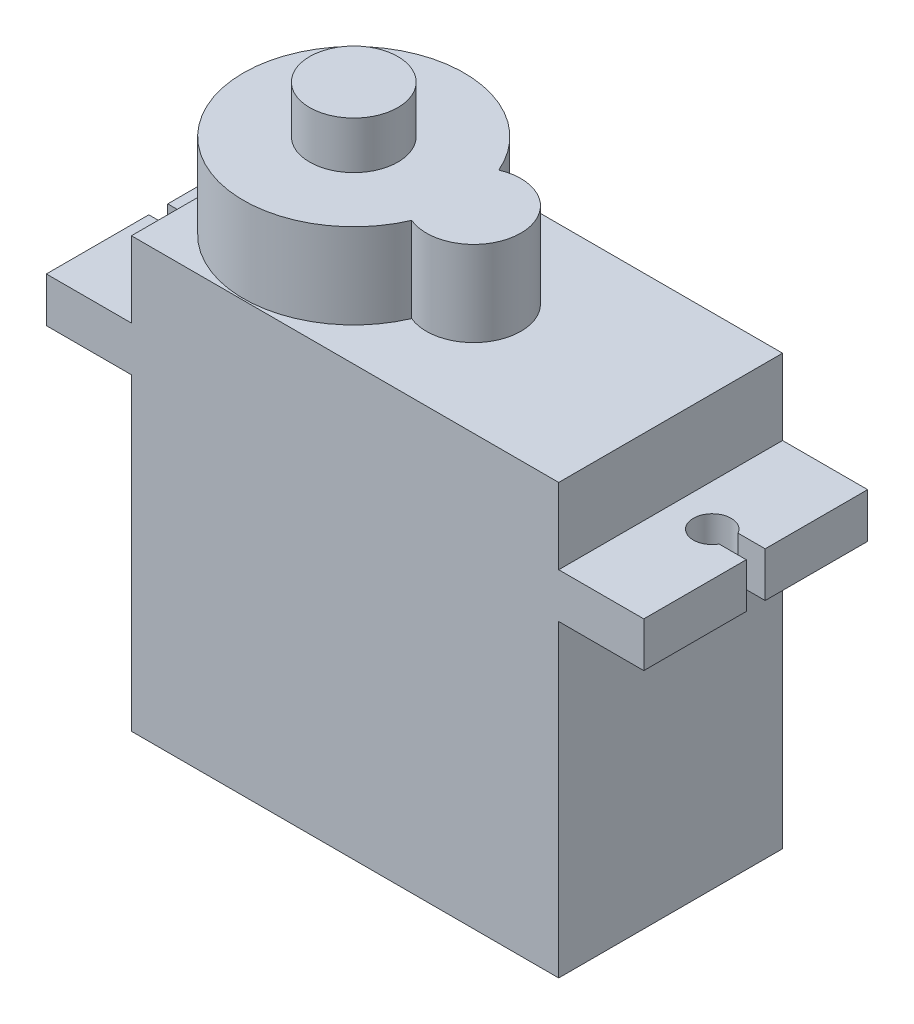
ISO-10303-21;
HEADER;
FILE_DESCRIPTION(('STEP AP214'),'2;1');
FILE_NAME('part.step','',(''),(''),'','','');
FILE_SCHEMA(('AUTOMOTIVE_DESIGN { 1 0 10303 214 1 1 1 1 }'));
ENDSEC;
DATA;
#1=APPLICATION_CONTEXT('core data for automotive mechanical design processes');
#2=APPLICATION_PROTOCOL_DEFINITION('international standard','automotive_design',2000,#1);
#3=PRODUCT_CONTEXT('',#1,'mechanical');
#4=PRODUCT('Part','Part','',(#3));
#5=PRODUCT_RELATED_PRODUCT_CATEGORY('part','',(#4));
#6=PRODUCT_DEFINITION_FORMATION('','',#4);
#7=PRODUCT_DEFINITION_CONTEXT('part definition',#1,'design');
#8=PRODUCT_DEFINITION('design','',#6,#7);
#9=PRODUCT_DEFINITION_SHAPE('','',#8);
#10=(LENGTH_UNIT() NAMED_UNIT(*) SI_UNIT(.MILLI.,.METRE.));
#11=(NAMED_UNIT(*) PLANE_ANGLE_UNIT() SI_UNIT($,.RADIAN.));
#12=(NAMED_UNIT(*) SI_UNIT($,.STERADIAN.) SOLID_ANGLE_UNIT());
#13=UNCERTAINTY_MEASURE_WITH_UNIT(LENGTH_MEASURE(1.E-05),#10,'distance_accuracy_value','');
#14=(GEOMETRIC_REPRESENTATION_CONTEXT(3) GLOBAL_UNCERTAINTY_ASSIGNED_CONTEXT((#13)) GLOBAL_UNIT_ASSIGNED_CONTEXT((#10,
#11,#12)) REPRESENTATION_CONTEXT('',''));
#15=CARTESIAN_POINT('',(0.,0.,0.));
#16=DIRECTION('',(0.,0.,1.));
#17=DIRECTION('',(1.,0.,0.));
#18=AXIS2_PLACEMENT_3D('',#15,#16,#17);
#19=CARTESIAN_POINT('',(-50.695532413833,0.,0.));
#20=DIRECTION('',(-1.,0.,0.));
#21=DIRECTION('',(0.,0.,1.));
#22=AXIS2_PLACEMENT_3D('',#19,#20,#21);
#23=PLANE('',#22);
#24=DIRECTION('',(0.,0.,-1.));
#25=VECTOR('',#24,1.);
#26=CARTESIAN_POINT('',(-50.695532413833,16.33,0.));
#27=LINE('',#26,#25);
#28=CARTESIAN_POINT('',(-50.695532413833,16.33,0.836861805785775));
#29=VERTEX_POINT('',#28);
#30=CARTESIAN_POINT('',(-50.695532413833,16.33,-4.58313819421423));
#31=VERTEX_POINT('',#30);
#32=EDGE_CURVE('E255',#29,#31,#27,.T.);
#33=ORIENTED_EDGE('',*,*,#32,.F.);
#34=DIRECTION('',(0.,1.,0.));
#35=VECTOR('',#34,1.);
#36=CARTESIAN_POINT('',(-50.695532413833,0.,0.836861805785775));
#37=LINE('',#36,#35);
#38=CARTESIAN_POINT('',(-50.695532413833,18.7,0.836861805785775));
#39=VERTEX_POINT('',#38);
#40=EDGE_CURVE('E46',#29,#39,#37,.T.);
#41=ORIENTED_EDGE('',*,*,#40,.T.);
#42=DIRECTION('',(0.,0.,-1.));
#43=VECTOR('',#42,1.);
#44=CARTESIAN_POINT('',(-50.695532413833,18.7,0.));
#45=LINE('',#44,#43);
#46=CARTESIAN_POINT('',(-50.695532413833,18.7,-4.58313819421423));
#47=VERTEX_POINT('',#46);
#48=EDGE_CURVE('E257',#39,#47,#45,.T.);
#49=ORIENTED_EDGE('',*,*,#48,.T.);
#50=DIRECTION('',(0.,-1.,0.));
#51=VECTOR('',#50,1.);
#52=CARTESIAN_POINT('',(-50.695532413833,0.,-4.58313819421423));
#53=LINE('',#52,#51);
#54=EDGE_CURVE('E261',#47,#31,#53,.T.);
#55=ORIENTED_EDGE('',*,*,#54,.T.);
#56=EDGE_LOOP('',(#33,#41,#49,#55));
#57=FACE_BOUND('',#56,.T.);
#58=ADVANCED_FACE('F38',(#57),#23,.T.);
#59=CARTESIAN_POINT('',(-46.195532413833,22.7,-4.58313819421423));
#60=DIRECTION('',(1.,0.,0.));
#61=DIRECTION('',(0.,0.,-1.));
#62=AXIS2_PLACEMENT_3D('',#59,#60,#61);
#63=PLANE('',#62);
#64=DIRECTION('',(0.,0.,-1.));
#65=VECTOR('',#64,1.);
#66=CARTESIAN_POINT('',(-46.195532413833,18.7,0.));
#67=LINE('',#66,#65);
#68=CARTESIAN_POINT('',(-46.195532413833,18.7,7.25686180578577));
#69=VERTEX_POINT('',#68);
#70=CARTESIAN_POINT('',(-46.195532413833,18.7,-4.58313819421423));
#71=VERTEX_POINT('',#70);
#72=EDGE_CURVE('E266',#69,#71,#67,.T.);
#73=ORIENTED_EDGE('',*,*,#72,.F.);
#74=DIRECTION('',(0.,-1.,0.));
#75=VECTOR('',#74,1.);
#76=CARTESIAN_POINT('',(-46.195532413833,22.7,7.25686180578577));
#77=LINE('',#76,#75);
#78=CARTESIAN_POINT('',(-46.195532413833,22.7,7.25686180578577));
#79=VERTEX_POINT('',#78);
#80=EDGE_CURVE('E352',#79,#69,#77,.T.);
#81=ORIENTED_EDGE('',*,*,#80,.F.);
#82=DIRECTION('',(0.,0.,1.));
#83=VECTOR('',#82,1.);
#84=CARTESIAN_POINT('',(-46.195532413833,22.7,-4.58313819421423));
#85=LINE('',#84,#83);
#86=CARTESIAN_POINT('',(-46.195532413833,22.7,1.33686180578577));
#87=VERTEX_POINT('',#86);
#88=EDGE_CURVE('E459',#87,#79,#85,.T.);
#89=ORIENTED_EDGE('',*,*,#88,.F.);
#90=CARTESIAN_POINT('',(-46.195532413833,22.7,-4.58313819421423));
#91=VERTEX_POINT('',#90);
#92=EDGE_CURVE('E499',#91,#87,#85,.T.);
#93=ORIENTED_EDGE('',*,*,#92,.F.);
#94=DIRECTION('',(0.,-1.,0.));
#95=VECTOR('',#94,1.);
#96=CARTESIAN_POINT('',(-46.195532413833,22.7,-4.58313819421423));
#97=LINE('',#96,#95);
#98=EDGE_CURVE('E460',#91,#71,#97,.T.);
#99=ORIENTED_EDGE('',*,*,#98,.T.);
#100=EDGE_LOOP('',(#73,#81,#89,#93,#99));
#101=FACE_BOUND('',#100,.T.);
#102=ADVANCED_FACE('F382',(#101),#63,.F.);
#103=CARTESIAN_POINT('',(-19.095532413833,16.33,0.));
#104=DIRECTION('',(0.,1.,0.));
#105=DIRECTION('',(0.,0.,1.));
#106=AXIS2_PLACEMENT_3D('',#103,#104,#105);
#107=PLANE('',#106);
#108=DIRECTION('',(-1.,0.,0.));
#109=VECTOR('',#108,1.);
#110=CARTESIAN_POINT('',(-19.095532413833,16.33,1.83686180578577));
#111=LINE('',#110,#109);
#112=CARTESIAN_POINT('',(-19.095532413833,16.33,1.83686180578577));
#113=VERTEX_POINT('',#112);
#114=CARTESIAN_POINT('',(-20.5295070100486,16.33,1.83686180578577));
#115=VERTEX_POINT('',#114);
#116=EDGE_CURVE('E295',#113,#115,#111,.T.);
#117=ORIENTED_EDGE('',*,*,#116,.F.);
#118=DIRECTION('',(0.,0.,-1.));
#119=VECTOR('',#118,1.);
#120=CARTESIAN_POINT('',(-19.095532413833,16.33,0.));
#121=LINE('',#120,#119);
#122=CARTESIAN_POINT('',(-19.095532413833,16.33,7.25686180578577));
#123=VERTEX_POINT('',#122);
#124=EDGE_CURVE('E306',#123,#113,#121,.T.);
#125=ORIENTED_EDGE('',*,*,#124,.F.);
#126=DIRECTION('',(-1.,0.,0.));
#127=VECTOR('',#126,1.);
#128=CARTESIAN_POINT('',(-19.095532413833,16.33,7.25686180578577));
#129=LINE('',#128,#127);
#130=CARTESIAN_POINT('',(-23.595532413833,16.33,7.25686180578577));
#131=VERTEX_POINT('',#130);
#132=EDGE_CURVE('E331',#123,#131,#129,.T.);
#133=ORIENTED_EDGE('',*,*,#132,.T.);
#134=DIRECTION('',(0.,0.,-1.));
#135=VECTOR('',#134,1.);
#136=CARTESIAN_POINT('',(-23.595532413833,16.33,0.));
#137=LINE('',#136,#135);
#138=CARTESIAN_POINT('',(-23.595532413833,16.33,-4.58313819421423));
#139=VERTEX_POINT('',#138);
#140=EDGE_CURVE('E300',#131,#139,#137,.T.);
#141=ORIENTED_EDGE('',*,*,#140,.T.);
#142=DIRECTION('',(-1.,0.,0.));
#143=VECTOR('',#142,1.);
#144=CARTESIAN_POINT('',(-19.095532413833,16.33,-4.58313819421423));
#145=LINE('',#144,#143);
#146=CARTESIAN_POINT('',(-19.095532413833,16.33,-4.58313819421423));
#147=VERTEX_POINT('',#146);
#148=EDGE_CURVE('E328',#147,#139,#145,.T.);
#149=ORIENTED_EDGE('',*,*,#148,.F.);
#150=CARTESIAN_POINT('',(-19.095532413833,16.33,0.836861805785775));
#151=VERTEX_POINT('',#150);
#152=EDGE_CURVE('E304',#151,#147,#121,.T.);
#153=ORIENTED_EDGE('',*,*,#152,.F.);
#154=DIRECTION('',(-1.,0.,0.));
#155=VECTOR('',#154,1.);
#156=CARTESIAN_POINT('',(-19.095532413833,16.33,0.836861805785775));
#157=LINE('',#156,#155);
#158=CARTESIAN_POINT('',(-20.5295070100486,16.33,0.836861805785775));
#159=VERTEX_POINT('',#158);
#160=EDGE_CURVE('E291',#151,#159,#157,.T.);
#161=ORIENTED_EDGE('',*,*,#160,.T.);
#162=CARTESIAN_POINT('',(-21.395532413833,16.33,1.33686180578577));
#163=DIRECTION('',(0.,1.,0.));
#164=DIRECTION('',(0.,0.,1.));
#165=AXIS2_PLACEMENT_3D('',#162,#163,#164);
#166=CIRCLE('',#165,1.);
#167=EDGE_CURVE('E297',#159,#115,#166,.T.);
#168=ORIENTED_EDGE('',*,*,#167,.T.);
#169=EDGE_LOOP('',(#117,#125,#133,#141,#149,#153,#161,#168));
#170=FACE_BOUND('',#169,.T.);
#171=ADVANCED_FACE('F388',(#170),#107,.F.);
#172=CARTESIAN_POINT('',(-19.095532413833,18.7,0.));
#173=DIRECTION('',(0.,1.,0.));
#174=DIRECTION('',(0.,0.,1.));
#175=AXIS2_PLACEMENT_3D('',#172,#173,#174);
#176=PLANE('',#175);
#177=DIRECTION('',(0.,0.,-1.));
#178=VECTOR('',#177,1.);
#179=CARTESIAN_POINT('',(-19.095532413833,18.7,0.));
#180=LINE('',#179,#178);
#181=CARTESIAN_POINT('',(-19.095532413833,18.7,7.25686180578577));
#182=VERTEX_POINT('',#181);
#183=CARTESIAN_POINT('',(-19.095532413833,18.7,1.83686180578577));
#184=VERTEX_POINT('',#183);
#185=EDGE_CURVE('E313',#182,#184,#180,.T.);
#186=ORIENTED_EDGE('',*,*,#185,.T.);
#187=DIRECTION('',(-1.,0.,0.));
#188=VECTOR('',#187,1.);
#189=CARTESIAN_POINT('',(0.,18.7,1.83686180578577));
#190=LINE('',#189,#188);
#191=CARTESIAN_POINT('',(-20.5295070100486,18.7,1.83686180578577));
#192=VERTEX_POINT('',#191);
#193=EDGE_CURVE('E285',#184,#192,#190,.T.);
#194=ORIENTED_EDGE('',*,*,#193,.T.);
#195=CARTESIAN_POINT('',(-21.395532413833,18.7,1.33686180578577));
#196=DIRECTION('',(0.,1.,0.));
#197=DIRECTION('',(0.,0.,1.));
#198=AXIS2_PLACEMENT_3D('',#195,#196,#197);
#199=CIRCLE('',#198,1.);
#200=CARTESIAN_POINT('',(-20.5295070100486,18.7,0.836861805785775));
#201=VERTEX_POINT('',#200);
#202=EDGE_CURVE('E282',#201,#192,#199,.T.);
#203=ORIENTED_EDGE('',*,*,#202,.F.);
#204=DIRECTION('',(-1.,0.,0.));
#205=VECTOR('',#204,1.);
#206=CARTESIAN_POINT('',(0.,18.7,0.836861805785775));
#207=LINE('',#206,#205);
#208=CARTESIAN_POINT('',(-19.095532413833,18.7,0.836861805785775));
#209=VERTEX_POINT('',#208);
#210=EDGE_CURVE('E279',#209,#201,#207,.T.);
#211=ORIENTED_EDGE('',*,*,#210,.F.);
#212=CARTESIAN_POINT('',(-19.095532413833,18.7,-4.58313819421423));
#213=VERTEX_POINT('',#212);
#214=EDGE_CURVE('E312',#209,#213,#180,.T.);
#215=ORIENTED_EDGE('',*,*,#214,.T.);
#216=DIRECTION('',(-1.,0.,0.));
#217=VECTOR('',#216,1.);
#218=CARTESIAN_POINT('',(-19.095532413833,18.7,-4.58313819421423));
#219=LINE('',#218,#217);
#220=CARTESIAN_POINT('',(-23.595532413833,18.7,-4.58313819421423));
#221=VERTEX_POINT('',#220);
#222=EDGE_CURVE('E332',#213,#221,#219,.T.);
#223=ORIENTED_EDGE('',*,*,#222,.T.);
#224=DIRECTION('',(0.,0.,-1.));
#225=VECTOR('',#224,1.);
#226=CARTESIAN_POINT('',(-23.595532413833,18.7,0.));
#227=LINE('',#226,#225);
#228=CARTESIAN_POINT('',(-23.595532413833,18.7,7.25686180578577));
#229=VERTEX_POINT('',#228);
#230=EDGE_CURVE('E305',#229,#221,#227,.T.);
#231=ORIENTED_EDGE('',*,*,#230,.F.);
#232=DIRECTION('',(-1.,0.,0.));
#233=VECTOR('',#232,1.);
#234=CARTESIAN_POINT('',(-19.095532413833,18.7,7.25686180578577));
#235=LINE('',#234,#233);
#236=EDGE_CURVE('E316',#182,#229,#235,.T.);
#237=ORIENTED_EDGE('',*,*,#236,.F.);
#238=EDGE_LOOP('',(#186,#194,#203,#211,#215,#223,#231,#237));
#239=FACE_BOUND('',#238,.T.);
#240=ADVANCED_FACE('F488',(#239),#176,.T.);
#241=CARTESIAN_POINT('',(-19.095532413833,0.,0.));
#242=DIRECTION('',(1.,0.,0.));
#243=DIRECTION('',(0.,0.,-1.));
#244=AXIS2_PLACEMENT_3D('',#241,#242,#243);
#245=PLANE('',#244);
#246=ORIENTED_EDGE('',*,*,#124,.T.);
#247=DIRECTION('',(0.,1.,0.));
#248=VECTOR('',#247,1.);
#249=CARTESIAN_POINT('',(-19.095532413833,0.,1.83686180578577));
#250=LINE('',#249,#248);
#251=EDGE_CURVE('E351',#113,#184,#250,.T.);
#252=ORIENTED_EDGE('',*,*,#251,.T.);
#253=ORIENTED_EDGE('',*,*,#185,.F.);
#254=DIRECTION('',(0.,-1.,0.));
#255=VECTOR('',#254,1.);
#256=CARTESIAN_POINT('',(-19.095532413833,0.,7.25686180578577));
#257=LINE('',#256,#255);
#258=EDGE_CURVE('E301',#182,#123,#257,.T.);
#259=ORIENTED_EDGE('',*,*,#258,.T.);
#260=EDGE_LOOP('',(#246,#252,#253,#259));
#261=FACE_BOUND('',#260,.T.);
#262=ADVANCED_FACE('F485',(#261),#245,.T.);
#263=CARTESIAN_POINT('',(-23.595532413833,22.7,-4.58313819421423));
#264=DIRECTION('',(-1.,0.,0.));
#265=DIRECTION('',(0.,0.,1.));
#266=AXIS2_PLACEMENT_3D('',#263,#264,#265);
#267=PLANE('',#266);
#268=ORIENTED_EDGE('',*,*,#140,.F.);
#269=DIRECTION('',(0.,-1.,0.));
#270=VECTOR('',#269,1.);
#271=CARTESIAN_POINT('',(-23.595532413833,22.7,7.25686180578577));
#272=LINE('',#271,#270);
#273=CARTESIAN_POINT('',(-23.595532413833,0.,7.25686180578577));
#274=VERTEX_POINT('',#273);
#275=EDGE_CURVE('E325',#131,#274,#272,.T.);
#276=ORIENTED_EDGE('',*,*,#275,.T.);
#277=DIRECTION('',(0.,0.,-1.));
#278=VECTOR('',#277,1.);
#279=CARTESIAN_POINT('',(-23.595532413833,0.,-4.58313819421423));
#280=LINE('',#279,#278);
#281=CARTESIAN_POINT('',(-23.595532413833,0.,-4.58313819421423));
#282=VERTEX_POINT('',#281);
#283=EDGE_CURVE('E447',#274,#282,#280,.T.);
#284=ORIENTED_EDGE('',*,*,#283,.T.);
#285=DIRECTION('',(0.,-1.,0.));
#286=VECTOR('',#285,1.);
#287=CARTESIAN_POINT('',(-23.595532413833,22.7,-4.58313819421423));
#288=LINE('',#287,#286);
#289=EDGE_CURVE('E462',#139,#282,#288,.T.);
#290=ORIENTED_EDGE('',*,*,#289,.F.);
#291=EDGE_LOOP('',(#268,#276,#284,#290));
#292=FACE_BOUND('',#291,.T.);
#293=ADVANCED_FACE('F477',(#292),#267,.F.);
#294=CARTESIAN_POINT('',(-46.195532413833,22.7,7.25686180578577));
#295=DIRECTION('',(0.,1.,0.));
#296=DIRECTION('',(0.,0.,1.));
#297=AXIS2_PLACEMENT_3D('',#294,#295,#296);
#298=PLANE('',#297);
#299=CARTESIAN_POINT('',(-40.355532413833,22.7,1.33686180578577));
#300=DIRECTION('',(0.,1.,0.));
#301=DIRECTION('',(0.,0.,1.));
#302=AXIS2_PLACEMENT_3D('',#299,#300,#301);
#303=CIRCLE('',#302,5.84);
#304=CARTESIAN_POINT('',(-34.9887185337068,22.7,-0.965942739998552));
#305=VERTEX_POINT('',#304);
#306=EDGE_CURVE('E504',#305,#87,#303,.T.);
#307=ORIENTED_EDGE('',*,*,#306,.F.);
#308=CARTESIAN_POINT('',(-34.015532413833,22.7,1.33686180578577));
#309=DIRECTION('',(0.,1.,0.));
#310=DIRECTION('',(0.,0.,1.));
#311=AXIS2_PLACEMENT_3D('',#308,#309,#310);
#312=CIRCLE('',#311,2.5);
#313=CARTESIAN_POINT('',(-34.9887185337068,22.7,3.6396663515701));
#314=VERTEX_POINT('',#313);
#315=EDGE_CURVE('E337',#314,#305,#312,.T.);
#316=ORIENTED_EDGE('',*,*,#315,.F.);
#317=EDGE_CURVE('E450',#87,#314,#303,.T.);
#318=ORIENTED_EDGE('',*,*,#317,.F.);
#319=ORIENTED_EDGE('',*,*,#88,.T.);
#320=DIRECTION('',(1.,0.,0.));
#321=VECTOR('',#320,1.);
#322=CARTESIAN_POINT('',(-46.195532413833,22.7,7.25686180578577));
#323=LINE('',#322,#321);
#324=CARTESIAN_POINT('',(-23.595532413833,22.7,7.25686180578577));
#325=VERTEX_POINT('',#324);
#326=EDGE_CURVE('E498',#79,#325,#323,.T.);
#327=ORIENTED_EDGE('',*,*,#326,.T.);
#328=DIRECTION('',(0.,0.,-1.));
#329=VECTOR('',#328,1.);
#330=CARTESIAN_POINT('',(-23.595532413833,22.7,-4.58313819421423));
#331=LINE('',#330,#329);
#332=CARTESIAN_POINT('',(-23.595532413833,22.7,-4.58313819421423));
#333=VERTEX_POINT('',#332);
#334=EDGE_CURVE('E497',#325,#333,#331,.T.);
#335=ORIENTED_EDGE('',*,*,#334,.T.);
#336=DIRECTION('',(-1.,0.,0.));
#337=VECTOR('',#336,1.);
#338=CARTESIAN_POINT('',(-46.195532413833,22.7,-4.58313819421423));
#339=LINE('',#338,#337);
#340=EDGE_CURVE('E453',#333,#91,#339,.T.);
#341=ORIENTED_EDGE('',*,*,#340,.T.);
#342=ORIENTED_EDGE('',*,*,#92,.T.);
#343=EDGE_LOOP('',(#307,#316,#318,#319,#327,#335,#341,#342));
#344=FACE_BOUND('',#343,.T.);
#345=ADVANCED_FACE('F531',(#344),#298,.T.);
#346=CARTESIAN_POINT('',(-40.355532413833,27.2,1.33686180578577));
#347=DIRECTION('',(0.,-1.,0.));
#348=DIRECTION('',(0.,0.,-1.));
#349=AXIS2_PLACEMENT_3D('',#346,#347,#348);
#350=CYLINDRICAL_SURFACE('',#349,5.84);
#351=DIRECTION('',(0.,-1.,0.));
#352=VECTOR('',#351,1.);
#353=CARTESIAN_POINT('',(-34.9887185337068,27.2,3.6396663515701));
#354=LINE('',#353,#352);
#355=CARTESIAN_POINT('',(-34.9887185337068,27.2,3.6396663515701));
#356=VERTEX_POINT('',#355);
#357=EDGE_CURVE('E510',#356,#314,#354,.T.);
#358=ORIENTED_EDGE('',*,*,#357,.F.);
#359=CARTESIAN_POINT('',(-40.355532413833,27.2,1.33686180578577));
#360=DIRECTION('',(0.,1.,0.));
#361=DIRECTION('',(0.,0.,1.));
#362=AXIS2_PLACEMENT_3D('',#359,#360,#361);
#363=CIRCLE('',#362,5.84);
#364=CARTESIAN_POINT('',(-34.9887185337068,27.2,-0.965942739998555));
#365=VERTEX_POINT('',#364);
#366=EDGE_CURVE('E445',#365,#356,#363,.T.);
#367=ORIENTED_EDGE('',*,*,#366,.F.);
#368=DIRECTION('',(0.,-1.,0.));
#369=VECTOR('',#368,1.);
#370=CARTESIAN_POINT('',(-34.9887185337068,27.2,-0.965942739998552));
#371=LINE('',#370,#369);
#372=EDGE_CURVE('E514',#365,#305,#371,.T.);
#373=ORIENTED_EDGE('',*,*,#372,.T.);
#374=ORIENTED_EDGE('',*,*,#306,.T.);
#375=ORIENTED_EDGE('',*,*,#317,.T.);
#376=EDGE_LOOP('',(#358,#367,#373,#374,#375));
#377=FACE_BOUND('',#376,.T.);
#378=ADVANCED_FACE('F526',(#377),#350,.T.);
#379=CARTESIAN_POINT('',(0.,27.2,0.));
#380=DIRECTION('',(0.,1.,0.));
#381=DIRECTION('',(0.,0.,1.));
#382=AXIS2_PLACEMENT_3D('',#379,#380,#381);
#383=PLANE('',#382);
#384=ORIENTED_EDGE('',*,*,#366,.T.);
#385=CARTESIAN_POINT('',(-34.015532413833,27.2,1.33686180578577));
#386=DIRECTION('',(0.,1.,0.));
#387=DIRECTION('',(0.,0.,1.));
#388=AXIS2_PLACEMENT_3D('',#385,#386,#387);
#389=CIRCLE('',#388,2.5);
#390=EDGE_CURVE('E517',#356,#365,#389,.T.);
#391=ORIENTED_EDGE('',*,*,#390,.T.);
#392=EDGE_LOOP('',(#384,#391));
#393=FACE_BOUND('',#392,.T.);
#394=CARTESIAN_POINT('',(-40.355532413833,27.2,1.33686180578577));
#395=DIRECTION('',(0.,1.,0.));
#396=DIRECTION('',(0.,0.,1.));
#397=AXIS2_PLACEMENT_3D('',#394,#395,#396);
#398=CIRCLE('',#397,2.335);
#399=CARTESIAN_POINT('',(-40.355532413833,27.2,3.67186180578577));
#400=VERTEX_POINT('',#399);
#401=EDGE_CURVE('E506',#400,#400,#398,.T.);
#402=ORIENTED_EDGE('',*,*,#401,.F.);
#403=EDGE_LOOP('',(#402));
#404=FACE_BOUND('',#403,.T.);
#405=ADVANCED_FACE('F521',(#393,#404),#383,.T.);
#406=CARTESIAN_POINT('',(-46.195532413833,16.33,7.25686180578577));
#407=VERTEX_POINT('',#406);
#408=CARTESIAN_POINT('',(-46.195532413833,0.,7.25686180578577));
#409=VERTEX_POINT('',#408);
#410=EDGE_CURVE('E61',#407,#409,#77,.T.);
#411=ORIENTED_EDGE('',*,*,#410,.F.);
#412=DIRECTION('',(0.,0.,-1.));
#413=VECTOR('',#412,1.);
#414=CARTESIAN_POINT('',(-46.195532413833,16.33,0.));
#415=LINE('',#414,#413);
#416=CARTESIAN_POINT('',(-46.195532413833,16.33,-4.58313819421423));
#417=VERTEX_POINT('',#416);
#418=EDGE_CURVE('E250',#407,#417,#415,.T.);
#419=ORIENTED_EDGE('',*,*,#418,.T.);
#420=CARTESIAN_POINT('',(-46.195532413833,0.,-4.58313819421423));
#421=VERTEX_POINT('',#420);
#422=EDGE_CURVE('E363',#417,#421,#97,.T.);
#423=ORIENTED_EDGE('',*,*,#422,.T.);
#424=DIRECTION('',(0.,0.,1.));
#425=VECTOR('',#424,1.);
#426=CARTESIAN_POINT('',(-46.195532413833,0.,-4.58313819421423));
#427=LINE('',#426,#425);
#428=EDGE_CURVE('E441',#421,#409,#427,.T.);
#429=ORIENTED_EDGE('',*,*,#428,.T.);
#430=EDGE_LOOP('',(#411,#419,#423,#429));
#431=FACE_BOUND('',#430,.T.);
#432=ADVANCED_FACE('F40',(#431),#63,.F.);
#433=CARTESIAN_POINT('',(-46.195532413833,22.7,7.25686180578577));
#434=DIRECTION('',(0.,0.,-1.));
#435=DIRECTION('',(-1.,0.,0.));
#436=AXIS2_PLACEMENT_3D('',#433,#434,#435);
#437=PLANE('',#436);
#438=DIRECTION('',(1.,0.,0.));
#439=VECTOR('',#438,1.);
#440=CARTESIAN_POINT('',(-46.195532413833,0.,7.25686180578577));
#441=LINE('',#440,#439);
#442=EDGE_CURVE('E444',#409,#274,#441,.T.);
#443=ORIENTED_EDGE('',*,*,#442,.T.);
#444=ORIENTED_EDGE('',*,*,#275,.F.);
#445=ORIENTED_EDGE('',*,*,#132,.F.);
#446=ORIENTED_EDGE('',*,*,#258,.F.);
#447=ORIENTED_EDGE('',*,*,#236,.T.);
#448=EDGE_CURVE('E471',#325,#229,#272,.T.);
#449=ORIENTED_EDGE('',*,*,#448,.F.);
#450=ORIENTED_EDGE('',*,*,#326,.F.);
#451=ORIENTED_EDGE('',*,*,#80,.T.);
#452=DIRECTION('',(1.,0.,0.));
#453=VECTOR('',#452,1.);
#454=CARTESIAN_POINT('',(-50.695532413833,18.7,7.25686180578577));
#455=LINE('',#454,#453);
#456=CARTESIAN_POINT('',(-50.695532413833,18.7,7.25686180578577));
#457=VERTEX_POINT('',#456);
#458=EDGE_CURVE('E274',#457,#69,#455,.T.);
#459=ORIENTED_EDGE('',*,*,#458,.F.);
#460=DIRECTION('',(0.,1.,0.));
#461=VECTOR('',#460,1.);
#462=CARTESIAN_POINT('',(-50.695532413833,0.,7.25686180578577));
#463=LINE('',#462,#461);
#464=CARTESIAN_POINT('',(-50.695532413833,16.33,7.25686180578577));
#465=VERTEX_POINT('',#464);
#466=EDGE_CURVE('E254',#465,#457,#463,.T.);
#467=ORIENTED_EDGE('',*,*,#466,.F.);
#468=DIRECTION('',(1.,0.,0.));
#469=VECTOR('',#468,1.);
#470=CARTESIAN_POINT('',(-50.695532413833,16.33,7.25686180578577));
#471=LINE('',#470,#469);
#472=EDGE_CURVE('E277',#465,#407,#471,.T.);
#473=ORIENTED_EDGE('',*,*,#472,.T.);
#474=ORIENTED_EDGE('',*,*,#410,.T.);
#475=EDGE_LOOP('',(#443,#444,#445,#446,#447,#449,#450,#451,#459,#467,#473,#474));
#476=FACE_BOUND('',#475,.T.);
#477=ADVANCED_FACE('F406',(#476),#437,.F.);
#478=ORIENTED_EDGE('',*,*,#448,.T.);
#479=ORIENTED_EDGE('',*,*,#230,.T.);
#480=EDGE_CURVE('E469',#333,#221,#288,.T.);
#481=ORIENTED_EDGE('',*,*,#480,.F.);
#482=ORIENTED_EDGE('',*,*,#334,.F.);
#483=EDGE_LOOP('',(#478,#479,#481,#482));
#484=FACE_BOUND('',#483,.T.);
#485=ADVANCED_FACE('F491',(#484),#267,.F.);
#486=CARTESIAN_POINT('',(-46.195532413833,22.7,-4.58313819421423));
#487=DIRECTION('',(0.,0.,1.));
#488=DIRECTION('',(1.,0.,0.));
#489=AXIS2_PLACEMENT_3D('',#486,#487,#488);
#490=PLANE('',#489);
#491=DIRECTION('',(-1.,0.,0.));
#492=VECTOR('',#491,1.);
#493=CARTESIAN_POINT('',(-46.195532413833,0.,-4.58313819421423));
#494=LINE('',#493,#492);
#495=EDGE_CURVE('E443',#282,#421,#494,.T.);
#496=ORIENTED_EDGE('',*,*,#495,.T.);
#497=ORIENTED_EDGE('',*,*,#422,.F.);
#498=DIRECTION('',(1.,0.,0.));
#499=VECTOR('',#498,1.);
#500=CARTESIAN_POINT('',(-50.695532413833,16.33,-4.58313819421423));
#501=LINE('',#500,#499);
#502=EDGE_CURVE('E264',#31,#417,#501,.T.);
#503=ORIENTED_EDGE('',*,*,#502,.F.);
#504=ORIENTED_EDGE('',*,*,#54,.F.);
#505=DIRECTION('',(1.,0.,0.));
#506=VECTOR('',#505,1.);
#507=CARTESIAN_POINT('',(-50.695532413833,18.7,-4.58313819421423));
#508=LINE('',#507,#506);
#509=EDGE_CURVE('E271',#47,#71,#508,.T.);
#510=ORIENTED_EDGE('',*,*,#509,.T.);
#511=ORIENTED_EDGE('',*,*,#98,.F.);
#512=ORIENTED_EDGE('',*,*,#340,.F.);
#513=ORIENTED_EDGE('',*,*,#480,.T.);
#514=ORIENTED_EDGE('',*,*,#222,.F.);
#515=DIRECTION('',(0.,1.,0.));
#516=VECTOR('',#515,1.);
#517=CARTESIAN_POINT('',(-19.095532413833,0.,-4.58313819421423));
#518=LINE('',#517,#516);
#519=EDGE_CURVE('E309',#147,#213,#518,.T.);
#520=ORIENTED_EDGE('',*,*,#519,.F.);
#521=ORIENTED_EDGE('',*,*,#148,.T.);
#522=ORIENTED_EDGE('',*,*,#289,.T.);
#523=EDGE_LOOP('',(#496,#497,#503,#504,#510,#511,#512,#513,#514,#520,#521,#522));
#524=FACE_BOUND('',#523,.T.);
#525=ADVANCED_FACE('F362',(#524),#490,.F.);
#526=CARTESIAN_POINT('',(-46.195532413833,0.,7.25686180578577));
#527=DIRECTION('',(0.,1.,0.));
#528=DIRECTION('',(0.,0.,1.));
#529=AXIS2_PLACEMENT_3D('',#526,#527,#528);
#530=PLANE('',#529);
#531=CARTESIAN_POINT('',(-40.355532413833,0.,1.33686180578577));
#532=DIRECTION('',(0.,-1.,0.));
#533=DIRECTION('',(0.,0.,-1.));
#534=AXIS2_PLACEMENT_3D('',#531,#532,#533);
#535=CIRCLE('',#534,2.5);
#536=CARTESIAN_POINT('',(-40.355532413833,0.,-1.16313819421423));
#537=VERTEX_POINT('',#536);
#538=EDGE_CURVE('E427',#537,#537,#535,.T.);
#539=ORIENTED_EDGE('',*,*,#538,.F.);
#540=EDGE_LOOP('',(#539));
#541=FACE_BOUND('',#540,.T.);
#542=ORIENTED_EDGE('',*,*,#428,.F.);
#543=ORIENTED_EDGE('',*,*,#495,.F.);
#544=ORIENTED_EDGE('',*,*,#283,.F.);
#545=ORIENTED_EDGE('',*,*,#442,.F.);
#546=EDGE_LOOP('',(#542,#543,#544,#545));
#547=FACE_BOUND('',#546,.T.);
#548=ADVANCED_FACE('F433',(#541,#547),#530,.F.);
#549=CARTESIAN_POINT('',(-40.355532413833,29.7,1.33686180578577));
#550=DIRECTION('',(0.,-1.,0.));
#551=DIRECTION('',(0.,0.,-1.));
#552=AXIS2_PLACEMENT_3D('',#549,#550,#551);
#553=CYLINDRICAL_SURFACE('',#552,2.335);
#554=CARTESIAN_POINT('',(-40.355532413833,29.7,1.33686180578577));
#555=DIRECTION('',(0.,1.,0.));
#556=DIRECTION('',(0.,0.,1.));
#557=AXIS2_PLACEMENT_3D('',#554,#555,#556);
#558=CIRCLE('',#557,2.335);
#559=CARTESIAN_POINT('',(-40.355532413833,29.7,3.67186180578577));
#560=VERTEX_POINT('',#559);
#561=EDGE_CURVE('E509',#560,#560,#558,.T.);
#562=ORIENTED_EDGE('',*,*,#561,.F.);
#563=EDGE_LOOP('',(#562));
#564=FACE_BOUND('',#563,.T.);
#565=ORIENTED_EDGE('',*,*,#401,.T.);
#566=EDGE_LOOP('',(#565));
#567=FACE_BOUND('',#566,.T.);
#568=ADVANCED_FACE('F436',(#564,#567),#553,.T.);
#569=CARTESIAN_POINT('',(-40.355532413833,29.7,1.33686180578577));
#570=DIRECTION('',(0.,1.,0.));
#571=DIRECTION('',(0.,0.,1.));
#572=AXIS2_PLACEMENT_3D('',#569,#570,#571);
#573=PLANE('',#572);
#574=ORIENTED_EDGE('',*,*,#561,.T.);
#575=EDGE_LOOP('',(#574));
#576=FACE_BOUND('',#575,.T.);
#577=ADVANCED_FACE('F557',(#576),#573,.T.);
#578=CARTESIAN_POINT('',(-34.015532413833,27.2,1.33686180578577));
#579=DIRECTION('',(0.,-1.,0.));
#580=DIRECTION('',(0.,0.,-1.));
#581=AXIS2_PLACEMENT_3D('',#578,#579,#580);
#582=CYLINDRICAL_SURFACE('',#581,2.5);
#583=ORIENTED_EDGE('',*,*,#315,.T.);
#584=ORIENTED_EDGE('',*,*,#372,.F.);
#585=ORIENTED_EDGE('',*,*,#390,.F.);
#586=ORIENTED_EDGE('',*,*,#357,.T.);
#587=EDGE_LOOP('',(#583,#584,#585,#586));
#588=FACE_BOUND('',#587,.T.);
#589=ADVANCED_FACE('F530',(#588),#582,.T.);
#590=DIRECTION('',(0.,1.,0.));
#591=VECTOR('',#590,1.);
#592=CARTESIAN_POINT('',(-19.095532413833,0.,0.836861805785775));
#593=LINE('',#592,#591);
#594=EDGE_CURVE('E349',#151,#209,#593,.T.);
#595=ORIENTED_EDGE('',*,*,#594,.F.);
#596=ORIENTED_EDGE('',*,*,#152,.T.);
#597=ORIENTED_EDGE('',*,*,#519,.T.);
#598=ORIENTED_EDGE('',*,*,#214,.F.);
#599=EDGE_LOOP('',(#595,#596,#597,#598));
#600=FACE_BOUND('',#599,.T.);
#601=ADVANCED_FACE('F564',(#600),#245,.T.);
#602=CARTESIAN_POINT('',(-21.395532413833,-2.50000000007189E-05,1.33686180578577));
#603=DIRECTION('',(0.,1.,0.));
#604=DIRECTION('',(0.,0.,1.));
#605=AXIS2_PLACEMENT_3D('',#602,#603,#604);
#606=CYLINDRICAL_SURFACE('',#605,1.);
#607=DIRECTION('',(0.,1.,0.));
#608=VECTOR('',#607,1.);
#609=CARTESIAN_POINT('',(-20.5295070100486,-2.50000000007189E-05,0.836861805785775));
#610=LINE('',#609,#608);
#611=EDGE_CURVE('E288',#159,#201,#610,.T.);
#612=ORIENTED_EDGE('',*,*,#611,.T.);
#613=ORIENTED_EDGE('',*,*,#202,.T.);
#614=DIRECTION('',(0.,1.,0.));
#615=VECTOR('',#614,1.);
#616=CARTESIAN_POINT('',(-20.5295070100486,-2.50000000007189E-05,1.83686180578577));
#617=LINE('',#616,#615);
#618=EDGE_CURVE('E289',#115,#192,#617,.T.);
#619=ORIENTED_EDGE('',*,*,#618,.F.);
#620=ORIENTED_EDGE('',*,*,#167,.F.);
#621=EDGE_LOOP('',(#612,#613,#619,#620));
#622=FACE_BOUND('',#621,.T.);
#623=ADVANCED_FACE('F571',(#622),#606,.F.);
#624=CARTESIAN_POINT('',(0.,-2.50000000007189E-05,1.83686180578577));
#625=DIRECTION('',(0.,0.,-1.));
#626=DIRECTION('',(-1.,0.,0.));
#627=AXIS2_PLACEMENT_3D('',#624,#625,#626);
#628=PLANE('',#627);
#629=ORIENTED_EDGE('',*,*,#116,.T.);
#630=ORIENTED_EDGE('',*,*,#618,.T.);
#631=ORIENTED_EDGE('',*,*,#193,.F.);
#632=ORIENTED_EDGE('',*,*,#251,.F.);
#633=EDGE_LOOP('',(#629,#630,#631,#632));
#634=FACE_BOUND('',#633,.T.);
#635=ADVANCED_FACE('F576',(#634),#628,.T.);
#636=CARTESIAN_POINT('',(0.,-2.50000000007189E-05,0.836861805785775));
#637=DIRECTION('',(0.,0.,-1.));
#638=DIRECTION('',(-1.,0.,0.));
#639=AXIS2_PLACEMENT_3D('',#636,#637,#638);
#640=PLANE('',#639);
#641=ORIENTED_EDGE('',*,*,#594,.T.);
#642=ORIENTED_EDGE('',*,*,#210,.T.);
#643=ORIENTED_EDGE('',*,*,#611,.F.);
#644=ORIENTED_EDGE('',*,*,#160,.F.);
#645=EDGE_LOOP('',(#641,#642,#643,#644));
#646=FACE_BOUND('',#645,.T.);
#647=ADVANCED_FACE('F573',(#646),#640,.F.);
#648=CARTESIAN_POINT('',(-50.695532413833,16.33,0.));
#649=DIRECTION('',(0.,-1.,0.));
#650=DIRECTION('',(0.,0.,-1.));
#651=AXIS2_PLACEMENT_3D('',#648,#649,#650);
#652=PLANE('',#651);
#653=DIRECTION('',(-1.,0.,0.));
#654=VECTOR('',#653,1.);
#655=CARTESIAN_POINT('',(-50.695532413833,16.33,1.83686180578577));
#656=LINE('',#655,#654);
#657=CARTESIAN_POINT('',(-49.195532413833,16.33,1.83686180578577));
#658=VERTEX_POINT('',#657);
#659=CARTESIAN_POINT('',(-50.695532413833,16.33,1.83686180578577));
#660=VERTEX_POINT('',#659);
#661=EDGE_CURVE('E242',#658,#660,#656,.T.);
#662=ORIENTED_EDGE('',*,*,#661,.F.);
#663=DIRECTION('',(0.,0.,-1.));
#664=VECTOR('',#663,1.);
#665=CARTESIAN_POINT('',(-49.195532413833,16.33,0.));
#666=LINE('',#665,#664);
#667=CARTESIAN_POINT('',(-49.195532413833,16.33,1.77275170013984));
#668=VERTEX_POINT('',#667);
#669=EDGE_CURVE('E245',#658,#668,#666,.T.);
#670=ORIENTED_EDGE('',*,*,#669,.T.);
#671=CARTESIAN_POINT('',(-48.295532413833,16.33,1.33686180578577));
#672=DIRECTION('',(0.,-1.,0.));
#673=DIRECTION('',(0.,0.,-1.));
#674=AXIS2_PLACEMENT_3D('',#671,#672,#673);
#675=CIRCLE('',#674,0.999999999999998);
#676=CARTESIAN_POINT('',(-49.195532413833,16.33,0.900971911431708));
#677=VERTEX_POINT('',#676);
#678=EDGE_CURVE('E248',#677,#668,#675,.T.);
#679=ORIENTED_EDGE('',*,*,#678,.F.);
#680=DIRECTION('',(0.,0.,-1.));
#681=VECTOR('',#680,1.);
#682=CARTESIAN_POINT('',(-49.195532413833,16.33,0.));
#683=LINE('',#682,#681);
#684=CARTESIAN_POINT('',(-49.195532413833,16.33,0.836861805785774));
#685=VERTEX_POINT('',#684);
#686=EDGE_CURVE('E209',#677,#685,#683,.T.);
#687=ORIENTED_EDGE('',*,*,#686,.T.);
#688=DIRECTION('',(-1.,0.,0.));
#689=VECTOR('',#688,1.);
#690=CARTESIAN_POINT('',(-50.695532413833,16.33,0.836861805785775));
#691=LINE('',#690,#689);
#692=EDGE_CURVE('E236',#685,#29,#691,.T.);
#693=ORIENTED_EDGE('',*,*,#692,.T.);
#694=ORIENTED_EDGE('',*,*,#32,.T.);
#695=ORIENTED_EDGE('',*,*,#502,.T.);
#696=ORIENTED_EDGE('',*,*,#418,.F.);
#697=ORIENTED_EDGE('',*,*,#472,.F.);
#698=EDGE_CURVE('E251',#465,#660,#27,.T.);
#699=ORIENTED_EDGE('',*,*,#698,.T.);
#700=EDGE_LOOP('',(#662,#670,#679,#687,#693,#694,#695,#696,#697,#699));
#701=FACE_BOUND('',#700,.T.);
#702=ADVANCED_FACE('F367',(#701),#652,.T.);
#703=CARTESIAN_POINT('',(-50.695532413833,18.7,0.));
#704=DIRECTION('',(0.,-1.,0.));
#705=DIRECTION('',(0.,0.,-1.));
#706=AXIS2_PLACEMENT_3D('',#703,#704,#705);
#707=PLANE('',#706);
#708=DIRECTION('',(0.,0.,1.));
#709=VECTOR('',#708,1.);
#710=CARTESIAN_POINT('',(-49.195532413833,18.7,0.));
#711=LINE('',#710,#709);
#712=CARTESIAN_POINT('',(-49.195532413833,18.7,1.77275170013984));
#713=VERTEX_POINT('',#712);
#714=CARTESIAN_POINT('',(-49.195532413833,18.7,1.83686180578577));
#715=VERTEX_POINT('',#714);
#716=EDGE_CURVE('E213',#713,#715,#711,.T.);
#717=ORIENTED_EDGE('',*,*,#716,.T.);
#718=DIRECTION('',(1.,0.,0.));
#719=VECTOR('',#718,1.);
#720=CARTESIAN_POINT('',(0.,18.7,1.83686180578576));
#721=LINE('',#720,#719);
#722=CARTESIAN_POINT('',(-50.695532413833,18.7,1.83686180578577));
#723=VERTEX_POINT('',#722);
#724=EDGE_CURVE('E228',#723,#715,#721,.T.);
#725=ORIENTED_EDGE('',*,*,#724,.F.);
#726=EDGE_CURVE('E258',#457,#723,#45,.T.);
#727=ORIENTED_EDGE('',*,*,#726,.F.);
#728=ORIENTED_EDGE('',*,*,#458,.T.);
#729=ORIENTED_EDGE('',*,*,#72,.T.);
#730=ORIENTED_EDGE('',*,*,#509,.F.);
#731=ORIENTED_EDGE('',*,*,#48,.F.);
#732=DIRECTION('',(1.,0.,0.));
#733=VECTOR('',#732,1.);
#734=CARTESIAN_POINT('',(0.,18.7,0.83686180578576));
#735=LINE('',#734,#733);
#736=CARTESIAN_POINT('',(-49.195532413833,18.7,0.836861805785774));
#737=VERTEX_POINT('',#736);
#738=EDGE_CURVE('E53',#39,#737,#735,.T.);
#739=ORIENTED_EDGE('',*,*,#738,.T.);
#740=DIRECTION('',(0.,0.,1.));
#741=VECTOR('',#740,1.);
#742=CARTESIAN_POINT('',(-49.195532413833,18.7,0.));
#743=LINE('',#742,#741);
#744=CARTESIAN_POINT('',(-49.195532413833,18.7,0.900971911431708));
#745=VERTEX_POINT('',#744);
#746=EDGE_CURVE('E207',#737,#745,#743,.T.);
#747=ORIENTED_EDGE('',*,*,#746,.T.);
#748=CARTESIAN_POINT('',(-48.295532413833,18.7,1.33686180578577));
#749=DIRECTION('',(0.,1.,0.));
#750=DIRECTION('',(0.,0.,1.));
#751=AXIS2_PLACEMENT_3D('',#748,#749,#750);
#752=CIRCLE('',#751,0.999999999999998);
#753=EDGE_CURVE('E216',#713,#745,#752,.T.);
#754=ORIENTED_EDGE('',*,*,#753,.F.);
#755=EDGE_LOOP('',(#717,#725,#727,#728,#729,#730,#731,#739,#747,#754));
#756=FACE_BOUND('',#755,.T.);
#757=ADVANCED_FACE('F225',(#756),#707,.F.);
#758=DIRECTION('',(0.,1.,0.));
#759=VECTOR('',#758,1.);
#760=CARTESIAN_POINT('',(-50.695532413833,0.,1.83686180578577));
#761=LINE('',#760,#759);
#762=EDGE_CURVE('E12',#660,#723,#761,.T.);
#763=ORIENTED_EDGE('',*,*,#762,.F.);
#764=ORIENTED_EDGE('',*,*,#698,.F.);
#765=ORIENTED_EDGE('',*,*,#466,.T.);
#766=ORIENTED_EDGE('',*,*,#726,.T.);
#767=EDGE_LOOP('',(#763,#764,#765,#766));
#768=FACE_BOUND('',#767,.T.);
#769=ADVANCED_FACE('F384',(#768),#23,.T.);
#770=CARTESIAN_POINT('',(-48.295532413833,-2.50000000007189E-05,1.33686180578577));
#771=DIRECTION('',(0.,1.,0.));
#772=DIRECTION('',(0.,0.,1.));
#773=AXIS2_PLACEMENT_3D('',#770,#771,#772);
#774=CYLINDRICAL_SURFACE('',#773,0.999999999999998);
#775=ORIENTED_EDGE('',*,*,#678,.T.);
#776=DIRECTION('',(0.,1.,0.));
#777=VECTOR('',#776,1.);
#778=CARTESIAN_POINT('',(-49.195532413833,-2.50000000007189E-05,1.77275170013984));
#779=LINE('',#778,#777);
#780=EDGE_CURVE('E219',#668,#713,#779,.T.);
#781=ORIENTED_EDGE('',*,*,#780,.T.);
#782=ORIENTED_EDGE('',*,*,#753,.T.);
#783=DIRECTION('',(0.,1.,0.));
#784=VECTOR('',#783,1.);
#785=CARTESIAN_POINT('',(-49.195532413833,-2.50000000007189E-05,0.900971911431708));
#786=LINE('',#785,#784);
#787=EDGE_CURVE('E202',#677,#745,#786,.T.);
#788=ORIENTED_EDGE('',*,*,#787,.F.);
#789=EDGE_LOOP('',(#775,#781,#782,#788));
#790=FACE_BOUND('',#789,.T.);
#791=ADVANCED_FACE('F217',(#790),#774,.F.);
#792=CARTESIAN_POINT('',(-49.195532413833,-2.50000000007189E-05,0.));
#793=DIRECTION('',(-1.,0.,0.));
#794=DIRECTION('',(0.,0.,1.));
#795=AXIS2_PLACEMENT_3D('',#792,#793,#794);
#796=PLANE('',#795);
#797=DIRECTION('',(0.,1.,0.));
#798=VECTOR('',#797,1.);
#799=CARTESIAN_POINT('',(-49.195532413833,-2.50000000007189E-05,1.83686180578577));
#800=LINE('',#799,#798);
#801=EDGE_CURVE('E237',#658,#715,#800,.T.);
#802=ORIENTED_EDGE('',*,*,#801,.T.);
#803=ORIENTED_EDGE('',*,*,#716,.F.);
#804=ORIENTED_EDGE('',*,*,#780,.F.);
#805=ORIENTED_EDGE('',*,*,#669,.F.);
#806=EDGE_LOOP('',(#802,#803,#804,#805));
#807=FACE_BOUND('',#806,.T.);
#808=ADVANCED_FACE('F378',(#807),#796,.T.);
#809=CARTESIAN_POINT('',(0.,-2.50000000007189E-05,1.83686180578576));
#810=DIRECTION('',(0.,0.,1.));
#811=DIRECTION('',(1.,0.,0.));
#812=AXIS2_PLACEMENT_3D('',#809,#810,#811);
#813=PLANE('',#812);
#814=ORIENTED_EDGE('',*,*,#661,.T.);
#815=ORIENTED_EDGE('',*,*,#762,.T.);
#816=ORIENTED_EDGE('',*,*,#724,.T.);
#817=ORIENTED_EDGE('',*,*,#801,.F.);
#818=EDGE_LOOP('',(#814,#815,#816,#817));
#819=FACE_BOUND('',#818,.T.);
#820=ADVANCED_FACE('F370',(#819),#813,.F.);
#821=CARTESIAN_POINT('',(0.,-2.50000000007189E-05,0.83686180578576));
#822=DIRECTION('',(0.,0.,1.));
#823=DIRECTION('',(1.,0.,0.));
#824=AXIS2_PLACEMENT_3D('',#821,#822,#823);
#825=PLANE('',#824);
#826=DIRECTION('',(0.,1.,0.));
#827=VECTOR('',#826,1.);
#828=CARTESIAN_POINT('',(-49.195532413833,-2.50000000007189E-05,0.836861805785774));
#829=LINE('',#828,#827);
#830=EDGE_CURVE('E212',#685,#737,#829,.T.);
#831=ORIENTED_EDGE('',*,*,#830,.T.);
#832=ORIENTED_EDGE('',*,*,#738,.F.);
#833=ORIENTED_EDGE('',*,*,#40,.F.);
#834=ORIENTED_EDGE('',*,*,#692,.F.);
#835=EDGE_LOOP('',(#831,#832,#833,#834));
#836=FACE_BOUND('',#835,.T.);
#837=ADVANCED_FACE('F368',(#836),#825,.T.);
#838=CARTESIAN_POINT('',(-49.195532413833,-2.50000000007189E-05,0.));
#839=DIRECTION('',(-1.,0.,0.));
#840=DIRECTION('',(0.,0.,1.));
#841=AXIS2_PLACEMENT_3D('',#838,#839,#840);
#842=PLANE('',#841);
#843=ORIENTED_EDGE('',*,*,#787,.T.);
#844=ORIENTED_EDGE('',*,*,#746,.F.);
#845=ORIENTED_EDGE('',*,*,#830,.F.);
#846=ORIENTED_EDGE('',*,*,#686,.F.);
#847=EDGE_LOOP('',(#843,#844,#845,#846));
#848=FACE_BOUND('',#847,.T.);
#849=ADVANCED_FACE('F204',(#848),#842,.T.);
#850=CARTESIAN_POINT('',(-40.355532413833,3.,1.33686180578577));
#851=DIRECTION('',(0.,-1.,0.));
#852=DIRECTION('',(0.,0.,-1.));
#853=AXIS2_PLACEMENT_3D('',#850,#851,#852);
#854=CYLINDRICAL_SURFACE('',#853,2.5);
#855=CARTESIAN_POINT('',(-40.355532413833,3.,1.33686180578577));
#856=DIRECTION('',(0.,-1.,0.));
#857=DIRECTION('',(0.,0.,-1.));
#858=AXIS2_PLACEMENT_3D('',#855,#856,#857);
#859=CIRCLE('',#858,2.5);
#860=CARTESIAN_POINT('',(-40.355532413833,3.,-1.16313819421423));
#861=VERTEX_POINT('',#860);
#862=EDGE_CURVE('E223',#861,#861,#859,.T.);
#863=ORIENTED_EDGE('',*,*,#862,.F.);
#864=EDGE_LOOP('',(#863));
#865=FACE_BOUND('',#864,.T.);
#866=ORIENTED_EDGE('',*,*,#538,.T.);
#867=EDGE_LOOP('',(#866));
#868=FACE_BOUND('',#867,.T.);
#869=ADVANCED_FACE('F376',(#865,#868),#854,.F.);
#870=CARTESIAN_POINT('',(-40.355532413833,3.,1.33686180578577));
#871=DIRECTION('',(0.,-1.,0.));
#872=DIRECTION('',(0.,0.,-1.));
#873=AXIS2_PLACEMENT_3D('',#870,#871,#872);
#874=PLANE('',#873);
#875=ORIENTED_EDGE('',*,*,#862,.T.);
#876=EDGE_LOOP('',(#875));
#877=FACE_BOUND('',#876,.T.);
#878=ADVANCED_FACE('F419',(#877),#874,.T.);
#879=CLOSED_SHELL('',(#58,#102,#171,#240,#262,#293,#345,#378,#405,#432,#477,#485,#525,#548,#568,
#577,#589,#601,#623,#635,#647,#702,#757,#769,#791,#808,#820,#837,#849,#869,#878));
#880=MANIFOLD_SOLID_BREP('B2',#879);
#881=ADVANCED_BREP_SHAPE_REPRESENTATION('',(#18,#880),#14);
#882=SHAPE_DEFINITION_REPRESENTATION(#9,#881);
ENDSEC;
END-ISO-10303-21;
